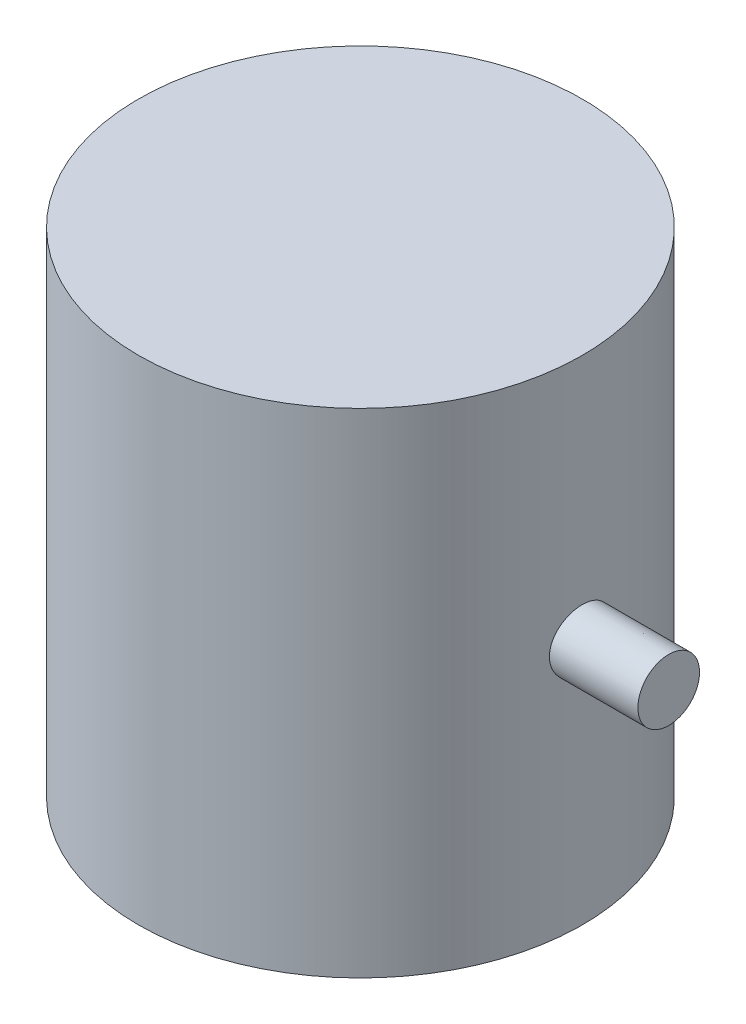
ISO-10303-21;
HEADER;
FILE_DESCRIPTION(('STEP AP214'),'2;1');
FILE_NAME('part.step','',(''),(''),'','','');
FILE_SCHEMA(('AUTOMOTIVE_DESIGN { 1 0 10303 214 1 1 1 1 }'));
ENDSEC;
DATA;
#1=APPLICATION_CONTEXT('core data for automotive mechanical design processes');
#2=APPLICATION_PROTOCOL_DEFINITION('international standard','automotive_design',2000,#1);
#3=PRODUCT_CONTEXT('',#1,'mechanical');
#4=PRODUCT('Part','Part','',(#3));
#5=PRODUCT_RELATED_PRODUCT_CATEGORY('part','',(#4));
#6=PRODUCT_DEFINITION_FORMATION('','',#4);
#7=PRODUCT_DEFINITION_CONTEXT('part definition',#1,'design');
#8=PRODUCT_DEFINITION('design','',#6,#7);
#9=PRODUCT_DEFINITION_SHAPE('','',#8);
#10=(LENGTH_UNIT() NAMED_UNIT(*) SI_UNIT(.MILLI.,.METRE.));
#11=(NAMED_UNIT(*) PLANE_ANGLE_UNIT() SI_UNIT($,.RADIAN.));
#12=(NAMED_UNIT(*) SI_UNIT($,.STERADIAN.) SOLID_ANGLE_UNIT());
#13=UNCERTAINTY_MEASURE_WITH_UNIT(LENGTH_MEASURE(1.E-05),#10,'distance_accuracy_value','');
#14=(GEOMETRIC_REPRESENTATION_CONTEXT(3) GLOBAL_UNCERTAINTY_ASSIGNED_CONTEXT((#13)) GLOBAL_UNIT_ASSIGNED_CONTEXT((#10,
#11,#12)) REPRESENTATION_CONTEXT('',''));
#15=CARTESIAN_POINT('',(0.,0.,0.));
#16=DIRECTION('',(0.,0.,1.));
#17=DIRECTION('',(1.,0.,0.));
#18=AXIS2_PLACEMENT_3D('',#15,#16,#17);
#19=CARTESIAN_POINT('',(17.8255434699759,20.,2.5));
#20=CARTESIAN_POINT('',(17.8255434699759,19.3384950947178,2.5));
#21=CARTESIAN_POINT('',(17.8675443323324,18.6926302433794,2.22826379620457));
#22=CARTESIAN_POINT('',(17.9584616494325,17.7714533824039,1.30688760006492));
#23=CARTESIAN_POINT('',(17.9999490713768,17.5003666861436,0.654434366622084));
#24=CARTESIAN_POINT('',(18.0000508193798,17.499634100409,-0.651629812178299));
#25=CARTESIAN_POINT('',(17.9590518001866,17.7655877255341,-1.30079071540844));
#26=CARTESIAN_POINT('',(17.8670401865249,18.6976246019702,-2.23348897919448));
#27=CARTESIAN_POINT('',(17.825578345189,19.3460619425166,-2.49975133213049));
#28=CARTESIAN_POINT('',(17.825508645536,20.6520353630235,-2.50024830584488));
#29=CARTESIAN_POINT('',(17.8673326698313,21.3047404341327,-2.22991579022321));
#30=CARTESIAN_POINT('',(17.9583039643911,22.2274317371146,-1.30897665695088));
#31=CARTESIAN_POINT('',(17.9999196654838,22.4994215912669,-0.663296270305864));
#32=CARTESIAN_POINT('',(18.0000800696097,22.5005765014057,0.658928974708573));
#33=CARTESIAN_POINT('',(17.958566149022,22.2293033448609,1.30551975824188));
#34=CARTESIAN_POINT('',(17.8676709486669,21.3089539351881,2.22728867417844));
#35=CARTESIAN_POINT('',(17.8255434699759,20.6615049052822,2.5));
#36=CARTESIAN_POINT('',(17.8255434699759,20.,2.5));
#37=B_SPLINE_CURVE_WITH_KNOTS('',3,(#19,#20,#21,#22,#23,#24,#25,#26,#27,#28,#29,#30,#31,#32,#33,
#34,#35,#36),.UNSPECIFIED.,.T.,.F.,(4,2,2,2,2,2,2,2,4),(0.,0.125,0.25,0.375,0.5,0.625,0.75,
0.875,1.),.UNSPECIFIED.);
#38=DIRECTION('',(1.,0.,0.));
#39=VECTOR('',#38,1.);
#40=SURFACE_OF_LINEAR_EXTRUSION('',#37,#39);
#41=CARTESIAN_POINT('',(17.8255434699759,20.,2.5));
#42=CARTESIAN_POINT('',(17.8255434699759,19.3384950947178,2.5));
#43=CARTESIAN_POINT('',(17.8675443323324,18.6926302433794,2.22826379620457));
#44=CARTESIAN_POINT('',(17.9584616494325,17.7714533824039,1.30688760006492));
#45=CARTESIAN_POINT('',(17.9999490713768,17.5003666861436,0.654434366622084));
#46=CARTESIAN_POINT('',(18.0000508193798,17.499634100409,-0.651629812178299));
#47=CARTESIAN_POINT('',(17.9590518001866,17.7655877255341,-1.30079071540844));
#48=CARTESIAN_POINT('',(17.8670401865249,18.6976246019702,-2.23348897919448));
#49=CARTESIAN_POINT('',(17.825578345189,19.3460619425166,-2.49975133213049));
#50=CARTESIAN_POINT('',(17.825508645536,20.6520353630235,-2.50024830584488));
#51=CARTESIAN_POINT('',(17.8673326698313,21.3047404341327,-2.22991579022321));
#52=CARTESIAN_POINT('',(17.9583039643911,22.2274317371146,-1.30897665695088));
#53=CARTESIAN_POINT('',(17.9999196654838,22.4994215912669,-0.663296270305864));
#54=CARTESIAN_POINT('',(18.0000800696097,22.5005765014057,0.658928974708573));
#55=CARTESIAN_POINT('',(17.958566149022,22.2293033448609,1.30551975824188));
#56=CARTESIAN_POINT('',(17.8676709486669,21.3089539351881,2.22728867417844));
#57=CARTESIAN_POINT('',(17.8255434699759,20.6615049052822,2.5));
#58=CARTESIAN_POINT('',(17.8255434699759,20.,2.5));
#59=B_SPLINE_CURVE_WITH_KNOTS('',3,(#41,#42,#43,#44,#45,#46,#47,#48,#49,#50,#51,#52,#53,#54,#55,
#56,#57,#58),.UNSPECIFIED.,.T.,.F.,(4,2,2,2,2,2,2,2,4),(0.,0.125,0.25,0.375,0.5,0.625,0.75,
0.875,1.),.UNSPECIFIED.);
#60=CARTESIAN_POINT('',(17.8255434699759,20.,2.5));
#61=VERTEX_POINT('',#60);
#62=EDGE_CURVE('E12',#61,#61,#59,.T.);
#63=ORIENTED_EDGE('',*,*,#62,.T.);
#64=EDGE_LOOP('',(#63));
#65=FACE_BOUND('',#64,.T.);
#66=CARTESIAN_POINT('',(25.,20.,2.5));
#67=CARTESIAN_POINT('',(25.,20.1408606229384,2.49998305921309));
#68=CARTESIAN_POINT('',(25.,20.2818264797885,2.48758915520409));
#69=CARTESIAN_POINT('',(25.,20.5598219563787,2.43921462577262));
#70=CARTESIAN_POINT('',(25.,20.6968426885776,2.40318452401557));
#71=CARTESIAN_POINT('',(25.,20.9629220571913,2.3090509222822));
#72=CARTESIAN_POINT('',(25.,21.0919929667513,2.25098249164301));
#73=CARTESIAN_POINT('',(25.,21.2768880376654,2.14859781395911));
#74=CARTESIAN_POINT('',(25.,21.3370629122332,2.11192649890965));
#75=CARTESIAN_POINT('',(25.,21.4541366190482,2.0336517327471));
#76=CARTESIAN_POINT('',(25.,21.5110355590286,1.99204844396585));
#77=CARTESIAN_POINT('',(25.,21.6217132202914,1.90362358429386));
#78=CARTESIAN_POINT('',(25.,21.6754480023526,1.85674699486925));
#79=CARTESIAN_POINT('',(25.,21.7785459046805,1.75841005394143));
#80=CARTESIAN_POINT('',(25.,21.8279091016258,1.70694978286872));
#81=CARTESIAN_POINT('',(25.,21.9219596869144,1.59988107754511));
#82=CARTESIAN_POINT('',(25.,21.9666450531365,1.54427086701473));
#83=CARTESIAN_POINT('',(25.,22.0510804103658,1.42944279037804));
#84=CARTESIAN_POINT('',(25.,22.0908301178466,1.37022471731079));
#85=CARTESIAN_POINT('',(25.,22.1999744858047,1.19172654702907));
#86=CARTESIAN_POINT('',(25.,22.2623481185836,1.06804575726888));
#87=CARTESIAN_POINT('',(25.,22.3663096439743,0.812342427603901));
#88=CARTESIAN_POINT('',(25.,22.407898279046,0.680320185853516));
#89=CARTESIAN_POINT('',(25.,22.4700856161801,0.406112893377622));
#90=CARTESIAN_POINT('',(25.,22.4898494440182,0.263732536132801));
#91=CARTESIAN_POINT('',(25.,22.5005424929263,0.0493901826527887));
#92=CARTESIAN_POINT('',(25.,22.5009456998278,-0.0222046120336785));
#93=CARTESIAN_POINT('',(25.,22.4954341863961,-0.165151574499112));
#94=CARTESIAN_POINT('',(25.,22.4895193701314,-0.236503738577534));
#95=CARTESIAN_POINT('',(25.,22.4631584995115,-0.444447967371369));
#96=CARTESIAN_POINT('',(25.,22.4343171577758,-0.580058620381194));
#97=CARTESIAN_POINT('',(25.,22.3549862291,-0.844823313071589));
#98=CARTESIAN_POINT('',(25.,22.3044780664218,-0.973971706092263));
#99=CARTESIAN_POINT('',(25.,22.1814637824196,-1.22601463552564));
#100=CARTESIAN_POINT('',(25.,22.1083641825262,-1.34862062518669));
#101=CARTESIAN_POINT('',(25.,21.9424951883968,-1.57957301399199));
#102=CARTESIAN_POINT('',(25.,21.8497494747678,-1.68793632809968));
#103=CARTESIAN_POINT('',(25.,21.6480801088282,-1.88488688894432));
#104=CARTESIAN_POINT('',(25.,21.5394349690018,-1.97375933006399));
#105=CARTESIAN_POINT('',(25.,21.3088012853225,-2.13223677975109));
#106=CARTESIAN_POINT('',(25.,21.1867956964425,-2.20181676628555));
#107=CARTESIAN_POINT('',(25.,20.9330336864478,-2.32032675555117));
#108=CARTESIAN_POINT('',(25.,20.8012751882286,-2.36925234449885));
#109=CARTESIAN_POINT('',(25.,20.5991677795837,-2.4259586882589));
#110=CARTESIAN_POINT('',(25.,20.5310598437937,-2.44207978310171));
#111=CARTESIAN_POINT('',(25.,20.393720913913,-2.4685860064871));
#112=CARTESIAN_POINT('',(25.,20.3244899867038,-2.47897147534179));
#113=CARTESIAN_POINT('',(25.,20.1838656076866,-2.49394833040443));
#114=CARTESIAN_POINT('',(25.,20.1124580155862,-2.49840773652095));
#115=CARTESIAN_POINT('',(25.,19.9695297419128,-2.50088100136579));
#116=CARTESIAN_POINT('',(25.,19.8980090570206,-2.49889466726869));
#117=CARTESIAN_POINT('',(25.,19.7553760632353,-2.48867571106047));
#118=CARTESIAN_POINT('',(25.,19.6842640076967,-2.48043956310238));
#119=CARTESIAN_POINT('',(25.,19.5430277476183,-2.45789306862688));
#120=CARTESIAN_POINT('',(25.,19.4729035769483,-2.44358251436893));
#121=CARTESIAN_POINT('',(25.,19.2699551050273,-2.39310250930246));
#122=CARTESIAN_POINT('',(25.,19.1390234207548,-2.34895051494596));
#123=CARTESIAN_POINT('',(25.,18.886070453421,-2.24021147139371));
#124=CARTESIAN_POINT('',(25.,18.764047814381,-2.17562754000295));
#125=CARTESIAN_POINT('',(25.,18.527461473769,-2.02438592922857));
#126=CARTESIAN_POINT('',(25.,18.4133841074342,-1.9369557934242));
#127=CARTESIAN_POINT('',(25.,18.2552319384971,-1.79192422042211));
#128=CARTESIAN_POINT('',(25.,18.204662369895,-1.74124920069055));
#129=CARTESIAN_POINT('',(25.,18.1081934783165,-1.63563193968215));
#130=CARTESIAN_POINT('',(25.,18.0622942521465,-1.58068960999458));
#131=CARTESIAN_POINT('',(25.,17.9350861142918,-1.41426518755801));
#132=CARTESIAN_POINT('',(25.,17.8604177893638,-1.29760509840864));
#133=CARTESIAN_POINT('',(25.,17.7309453593761,-1.05371032664167));
#134=CARTESIAN_POINT('',(25.,17.6761580776799,-0.92646679969058));
#135=CARTESIAN_POINT('',(25.,17.5864468788369,-0.660639680806277));
#136=CARTESIAN_POINT('',(25.,17.5522036792711,-0.521825040389989));
#137=CARTESIAN_POINT('',(25.,17.5078722584347,-0.240498174002142));
#138=CARTESIAN_POINT('',(25.,17.497754780233,-0.0979906386773705));
#139=CARTESIAN_POINT('',(25.,17.5030193996343,0.183810532876498));
#140=CARTESIAN_POINT('',(25.,17.5179161088416,0.323113384546806));
#141=CARTESIAN_POINT('',(25.,17.5705994342425,0.597412839899429));
#142=CARTESIAN_POINT('',(25.,17.608416111227,0.732403542776382));
#143=CARTESIAN_POINT('',(25.,17.7055869253739,0.995044114002269));
#144=CARTESIAN_POINT('',(25.,17.7650201418331,1.12266500917267));
#145=CARTESIAN_POINT('',(25.,17.8691284914405,1.30533275672307));
#146=CARTESIAN_POINT('',(25.,17.9063197715859,1.36475574985356));
#147=CARTESIAN_POINT('',(25.,17.9855523102122,1.48029413941256));
#148=CARTESIAN_POINT('',(25.,18.0275931989449,1.53640978751042));
#149=CARTESIAN_POINT('',(25.,18.1172031610744,1.64587507526456));
#150=CARTESIAN_POINT('',(25.,18.164863596794,1.69915001322782));
#151=CARTESIAN_POINT('',(25.,18.26478407634,1.80119947405993));
#152=CARTESIAN_POINT('',(25.,18.3170443524549,1.84997376939463));
#153=CARTESIAN_POINT('',(25.,18.4256529292717,1.94282298483093));
#154=CARTESIAN_POINT('',(25.,18.4820043698093,1.9868942300402));
#155=CARTESIAN_POINT('',(25.,18.5982628964359,2.07003349852222));
#156=CARTESIAN_POINT('',(25.,18.6581699943887,2.10910150509983));
#157=CARTESIAN_POINT('',(25.,18.8381396727763,2.21588095400729));
#158=CARTESIAN_POINT('',(25.,18.9624703885487,2.27655875250777));
#159=CARTESIAN_POINT('',(25.,19.2191144470572,2.37698875274898));
#160=CARTESIAN_POINT('',(25.,19.3514171692725,2.41676813769365));
#161=CARTESIAN_POINT('',(25.,19.5704481374921,2.46346294100464));
#162=CARTESIAN_POINT('',(25.,19.6557889056429,2.47710092209783));
#163=CARTESIAN_POINT('',(25.,19.8274068102561,2.49537324422429));
#164=CARTESIAN_POINT('',(25.,19.9136836475973,2.50001038094893));
#165=CARTESIAN_POINT('',(25.,20.,2.5));
#166=B_SPLINE_CURVE_WITH_KNOTS('',3,(#66,#67,#68,#69,#70,#71,#72,#73,#74,#75,#76,#77,#78,#79,
#80,#81,#82,#83,#84,#85,#86,#87,#88,#89,#90,#91,#92,#93,#94,#95,#96,#97,#98,#99,#100,#101,#102,
#103,#104,#105,#106,#107,#108,#109,#110,#111,#112,#113,#114,#115,#116,#117,#118,#119,#120,#121,
#122,#123,#124,#125,#126,#127,#128,#129,#130,#131,#132,#133,#134,#135,#136,#137,#138,#139,#140,
#141,#142,#143,#144,#145,#146,#147,#148,#149,#150,#151,#152,#153,#154,#155,#156,#157,#158,#159,
#160,#161,#162,#163,#164,#165),.UNSPECIFIED.,.T.,.F.,(4,2,2,2,2,2,2,2,2,2,2,2,2,2,2,2,2,2,2,2,2,
2,2,2,2,2,2,2,2,2,2,2,2,2,2,2,2,2,2,2,2,2,2,2,2,2,2,2,2,4),(0.,0.42226520592823,
0.84541714863467,1.26789853882999,1.47910190446574,1.69029832044648,1.90394881666852,
2.1175955646741,2.33133428928971,2.54508528634917,2.95864021929461,3.37218037860814,
3.80104406278028,4.01558744977376,4.2301340943859,4.64402463519944,5.05827073054076,
5.48448685504646,5.91019213035936,6.32917687646606,6.74870252447701,7.16831777854794,
7.37808876414693,7.58784730205906,7.80220320079668,8.01656551208655,8.23104884636203,
8.44553951641219,8.85808224066518,9.27056204343067,9.69936665716731,9.91389383981439,
10.1284254682522,10.541926441834,10.9557765089659,11.3826745484873,11.8090546307517,
12.2272562595854,12.6460075732487,13.0663064624534,13.2764127256135,13.4865029802358,
13.7006656465592,13.9148391341487,14.1291787668307,14.3435191147163,14.7566206801712,
15.1691835730549,15.4280189940657,15.6867740070848),.UNSPECIFIED.);
#167=CARTESIAN_POINT('',(25.,20.,2.5));
#168=VERTEX_POINT('',#167);
#169=EDGE_CURVE('E62',#168,#168,#166,.T.);
#170=ORIENTED_EDGE('',*,*,#169,.T.);
#171=EDGE_LOOP('',(#170));
#172=FACE_BOUND('',#171,.T.);
#173=ADVANCED_FACE('F55',(#65,#172),#40,.T.);
#174=CARTESIAN_POINT('',(17.7633432803578,19.6527173837105,3.58877801950382));
#175=CARTESIAN_POINT('',(17.7924358252725,20.4399753219998,2.94050196006985));
#176=CARTESIAN_POINT('',(17.8465706739227,21.2272330591496,2.29222606499492));
#177=CARTESIAN_POINT('',(17.9392820363433,22.0144904864532,1.64395042310754));
#178=CARTESIAN_POINT('',(18.0055842116724,22.8017481258752,0.995674607889895));
#179=CARTESIAN_POINT('',(18.060588828918,23.589005856039,0.347398718523488));
#180=CARTESIAN_POINT('',(17.8199589196438,19.0044253740319,2.80150163346228));
#181=CARTESIAN_POINT('',(17.8314892636665,19.7916834533806,2.15322545876309));
#182=CARTESIAN_POINT('',(17.8674219425166,20.57894133673,1.50494944422267));
#183=CARTESIAN_POINT('',(17.9412598066682,21.3661989156254,0.856673678463682));
#184=CARTESIAN_POINT('',(17.9929820006742,22.1534566721536,0.208397767553891));
#185=CARTESIAN_POINT('',(18.0319174569739,22.9407145313848,-0.439878227278534));
#186=CARTESIAN_POINT('',(17.8883979966696,18.3561332693876,2.014225325021));
#187=CARTESIAN_POINT('',(17.8855814759831,19.1433914639702,1.36594905615966));
#188=CARTESIAN_POINT('',(17.895207389736,19.9306495586153,0.717672868961205));
#189=CARTESIAN_POINT('',(17.9286722930979,20.7179074617858,0.0693968382241407));
#190=CARTESIAN_POINT('',(17.9574721933786,21.5051654024256,-0.578879223130533));
#191=CARTESIAN_POINT('',(17.9806304351314,22.2924233883792,-1.22715532151286));
#192=CARTESIAN_POINT('',(17.9799649794511,17.7078409789803,1.22694916837408));
#193=CARTESIAN_POINT('',(17.9573424763721,18.4950993326443,0.578672769521011));
#194=CARTESIAN_POINT('',(17.9294726638017,19.2823577284546,-0.0696036637714966));
#195=CARTESIAN_POINT('',(17.8964058485941,20.0696161660072,-0.717880131173263));
#196=CARTESIAN_POINT('',(17.8851307951622,20.8568744285286,-1.36615645555012));
#197=CARTESIAN_POINT('',(17.8869522305832,21.6441325858591,-2.01443269397136));
#198=CARTESIAN_POINT('',(18.0318723252203,17.0595490071187,0.439672751430814));
#199=CARTESIAN_POINT('',(17.9929845921044,17.8468074914248,-0.208603754175126));
#200=CARTESIAN_POINT('',(17.9404742804813,18.6340660851474,-0.856880349189537));
#201=CARTESIAN_POINT('',(17.8683756419151,19.4213248362031,-1.50515707276715));
#202=CARTESIAN_POINT('',(17.8325308891603,20.208583296068,-2.15343355840123));
#203=CARTESIAN_POINT('',(17.8201310131267,20.995841567624,-2.80170989016059));
#204=CARTESIAN_POINT('',(18.060722144544,16.4112572204549,-0.347603816844903));
#205=CARTESIAN_POINT('',(18.005599975995,17.1985158351558,-0.9958804290016));
#206=CARTESIAN_POINT('',(17.9392208749242,17.9857745402723,-1.64415711504043));
#207=CARTESIAN_POINT('',(17.8453336882888,18.7730334663334,-2.29243398162186));
#208=CARTESIAN_POINT('',(17.7935687625084,19.560292054069,-2.94071057174411));
#209=CARTESIAN_POINT('',(17.7647353636382,20.3475504576189,-3.58898701136089));
#210=B_SPLINE_SURFACE_WITH_KNOTS('',5,5,((#174,#175,#176,#177,#178,#179),(#180,#181,#182,#183,
#184,#185),(#186,#187,#188,#189,#190,#191),(#192,#193,#194,#195,#196,#197),(#198,#199,#200,#201,
#202,#203),(#204,#205,#206,#207,#208,#209)),.UNSPECIFIED.,.F.,.F.,.F.,(6,6),(6,6),
(-2.5501129669089,2.54911891962384),(-2.54945483671344,2.54965666924439),.UNSPECIFIED.);
#211=ORIENTED_EDGE('',*,*,#62,.F.);
#212=EDGE_LOOP('',(#211));
#213=FACE_BOUND('',#212,.T.);
#214=ADVANCED_FACE('F57',(#213),#210,.F.);
#215=CARTESIAN_POINT('',(25.,28.4335973201616,10.));
#216=DIRECTION('',(1.,0.,0.));
#217=DIRECTION('',(0.,1.,0.));
#218=AXIS2_PLACEMENT_3D('',#215,#216,#217);
#219=PLANE('',#218);
#220=ORIENTED_EDGE('',*,*,#169,.F.);
#221=EDGE_LOOP('',(#220));
#222=FACE_BOUND('',#221,.T.);
#223=ADVANCED_FACE('F77',(#222),#219,.T.);
#224=CLOSED_SHELL('',(#173,#214,#223));
#225=MANIFOLD_SOLID_BREP('B2',#224);
#226=CARTESIAN_POINT('',(0.,40.,0.));
#227=DIRECTION('',(0.,-1.,0.));
#228=DIRECTION('',(0.,0.,-1.));
#229=AXIS2_PLACEMENT_3D('',#226,#227,#228);
#230=CYLINDRICAL_SURFACE('',#229,18.);
#231=CARTESIAN_POINT('',(0.,40.,0.));
#232=DIRECTION('',(0.,1.,0.));
#233=DIRECTION('',(0.,0.,1.));
#234=AXIS2_PLACEMENT_3D('',#231,#232,#233);
#235=CIRCLE('',#234,18.);
#236=CARTESIAN_POINT('',(0.,40.,18.));
#237=VERTEX_POINT('',#236);
#238=EDGE_CURVE('E54',#237,#237,#235,.T.);
#239=ORIENTED_EDGE('',*,*,#238,.F.);
#240=EDGE_LOOP('',(#239));
#241=FACE_BOUND('',#240,.T.);
#242=CARTESIAN_POINT('',(0.,0.,0.));
#243=DIRECTION('',(0.,1.,0.));
#244=DIRECTION('',(0.,0.,1.));
#245=AXIS2_PLACEMENT_3D('',#242,#243,#244);
#246=CIRCLE('',#245,18.);
#247=CARTESIAN_POINT('',(0.,0.,18.));
#248=VERTEX_POINT('',#247);
#249=EDGE_CURVE('E137',#248,#248,#246,.T.);
#250=ORIENTED_EDGE('',*,*,#249,.T.);
#251=EDGE_LOOP('',(#250));
#252=FACE_BOUND('',#251,.T.);
#253=ADVANCED_FACE('F134',(#241,#252),#230,.T.);
#254=CARTESIAN_POINT('',(0.,40.,0.));
#255=DIRECTION('',(0.,1.,0.));
#256=DIRECTION('',(0.,0.,1.));
#257=AXIS2_PLACEMENT_3D('',#254,#255,#256);
#258=PLANE('',#257);
#259=ORIENTED_EDGE('',*,*,#238,.T.);
#260=EDGE_LOOP('',(#259));
#261=FACE_BOUND('',#260,.T.);
#262=ADVANCED_FACE('F165',(#261),#258,.T.);
#263=CARTESIAN_POINT('',(0.,0.,0.));
#264=DIRECTION('',(0.,1.,0.));
#265=DIRECTION('',(0.,0.,1.));
#266=AXIS2_PLACEMENT_3D('',#263,#264,#265);
#267=PLANE('',#266);
#268=CARTESIAN_POINT('',(0.,0.,0.));
#269=DIRECTION('',(0.,1.,0.));
#270=DIRECTION('',(0.,0.,1.));
#271=AXIS2_PLACEMENT_3D('',#268,#269,#270);
#272=CIRCLE('',#271,13.);
#273=CARTESIAN_POINT('',(0.,0.,13.));
#274=VERTEX_POINT('',#273);
#275=EDGE_CURVE('E146',#274,#274,#272,.T.);
#276=ORIENTED_EDGE('',*,*,#275,.T.);
#277=EDGE_LOOP('',(#276));
#278=FACE_BOUND('',#277,.T.);
#279=ORIENTED_EDGE('',*,*,#249,.F.);
#280=EDGE_LOOP('',(#279));
#281=FACE_BOUND('',#280,.T.);
#282=ADVANCED_FACE('F161',(#278,#281),#267,.F.);
#283=CARTESIAN_POINT('',(0.,40.,0.));
#284=DIRECTION('',(0.,-1.,0.));
#285=DIRECTION('',(0.,0.,-1.));
#286=AXIS2_PLACEMENT_3D('',#283,#284,#285);
#287=CYLINDRICAL_SURFACE('',#286,13.);
#288=CARTESIAN_POINT('',(0.,35.,0.));
#289=DIRECTION('',(0.,1.,0.));
#290=DIRECTION('',(0.,0.,1.));
#291=AXIS2_PLACEMENT_3D('',#288,#289,#290);
#292=CIRCLE('',#291,13.);
#293=CARTESIAN_POINT('',(0.,35.,13.));
#294=VERTEX_POINT('',#293);
#295=EDGE_CURVE('E144',#294,#294,#292,.T.);
#296=ORIENTED_EDGE('',*,*,#295,.T.);
#297=EDGE_LOOP('',(#296));
#298=FACE_BOUND('',#297,.T.);
#299=ORIENTED_EDGE('',*,*,#275,.F.);
#300=EDGE_LOOP('',(#299));
#301=FACE_BOUND('',#300,.T.);
#302=ADVANCED_FACE('F152',(#298,#301),#287,.F.);
#303=CARTESIAN_POINT('',(0.,35.,0.));
#304=DIRECTION('',(0.,1.,0.));
#305=DIRECTION('',(0.,0.,1.));
#306=AXIS2_PLACEMENT_3D('',#303,#304,#305);
#307=PLANE('',#306);
#308=ORIENTED_EDGE('',*,*,#295,.F.);
#309=EDGE_LOOP('',(#308));
#310=FACE_BOUND('',#309,.T.);
#311=ADVANCED_FACE('F155',(#310),#307,.F.);
#312=CLOSED_SHELL('',(#253,#262,#282,#302,#311));
#313=MANIFOLD_SOLID_BREP('B7',#312);
#314=ADVANCED_BREP_SHAPE_REPRESENTATION('',(#18,#225,#313),#14);
#315=SHAPE_DEFINITION_REPRESENTATION(#9,#314);
ENDSEC;
END-ISO-10303-21;
